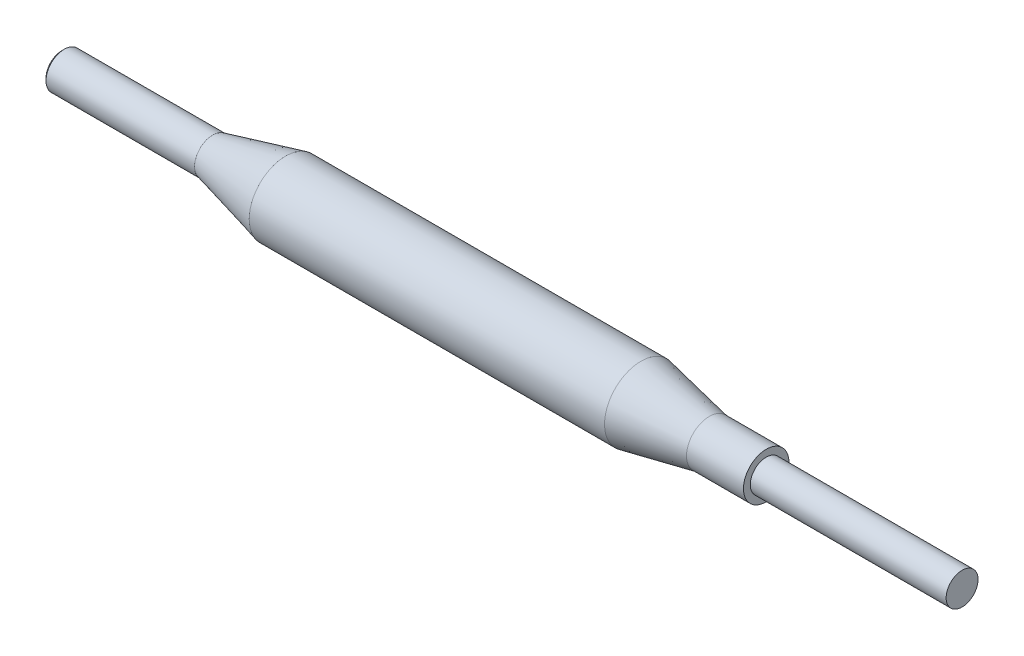
ISO-10303-21;
HEADER;
FILE_DESCRIPTION(('STEP AP214'),'2;1');
FILE_NAME('part.step','',(''),(''),'','','');
FILE_SCHEMA(('AUTOMOTIVE_DESIGN { 1 0 10303 214 1 1 1 1 }'));
ENDSEC;
DATA;
#1=APPLICATION_CONTEXT('core data for automotive mechanical design processes');
#2=APPLICATION_PROTOCOL_DEFINITION('international standard','automotive_design',2000,#1);
#3=PRODUCT_CONTEXT('',#1,'mechanical');
#4=PRODUCT('Part','Part','',(#3));
#5=PRODUCT_RELATED_PRODUCT_CATEGORY('part','',(#4));
#6=PRODUCT_DEFINITION_FORMATION('','',#4);
#7=PRODUCT_DEFINITION_CONTEXT('part definition',#1,'design');
#8=PRODUCT_DEFINITION('design','',#6,#7);
#9=PRODUCT_DEFINITION_SHAPE('','',#8);
#10=(LENGTH_UNIT() NAMED_UNIT(*) SI_UNIT(.MILLI.,.METRE.));
#11=(NAMED_UNIT(*) PLANE_ANGLE_UNIT() SI_UNIT($,.RADIAN.));
#12=(NAMED_UNIT(*) SI_UNIT($,.STERADIAN.) SOLID_ANGLE_UNIT());
#13=UNCERTAINTY_MEASURE_WITH_UNIT(LENGTH_MEASURE(1.E-05),#10,'distance_accuracy_value','');
#14=(GEOMETRIC_REPRESENTATION_CONTEXT(3) GLOBAL_UNCERTAINTY_ASSIGNED_CONTEXT((#13)) GLOBAL_UNIT_ASSIGNED_CONTEXT((#10,
#11,#12)) REPRESENTATION_CONTEXT('',''));
#15=CARTESIAN_POINT('',(0.,0.,0.));
#16=DIRECTION('',(0.,0.,1.));
#17=DIRECTION('',(1.,0.,0.));
#18=AXIS2_PLACEMENT_3D('',#15,#16,#17);
#19=CARTESIAN_POINT('',(1.89,0.,0.));
#20=DIRECTION('',(-1.,0.,0.));
#21=DIRECTION('',(0.,0.,1.));
#22=AXIS2_PLACEMENT_3D('',#19,#20,#21);
#23=CYLINDRICAL_SURFACE('',#22,5.);
#24=CARTESIAN_POINT('',(144.,0.,0.));
#25=DIRECTION('',(-1.,0.,0.));
#26=DIRECTION('',(0.,0.,1.));
#27=AXIS2_PLACEMENT_3D('',#24,#25,#26);
#28=CIRCLE('',#27,5.);
#29=CARTESIAN_POINT('',(144.,0.,5.));
#30=VERTEX_POINT('',#29);
#31=EDGE_CURVE('E80',#30,#30,#28,.T.);
#32=ORIENTED_EDGE('',*,*,#31,.F.);
#33=EDGE_LOOP('',(#32));
#34=FACE_BOUND('',#33,.T.);
#35=CARTESIAN_POINT('',(156.49,0.,0.));
#36=DIRECTION('',(-1.,0.,0.));
#37=DIRECTION('',(0.,0.,1.));
#38=AXIS2_PLACEMENT_3D('',#35,#36,#37);
#39=CIRCLE('',#38,5.);
#40=CARTESIAN_POINT('',(156.49,0.,5.));
#41=VERTEX_POINT('',#40);
#42=EDGE_CURVE('E53',#41,#41,#39,.T.);
#43=ORIENTED_EDGE('',*,*,#42,.T.);
#44=EDGE_LOOP('',(#43));
#45=FACE_BOUND('',#44,.T.);
#46=ADVANCED_FACE('F39',(#34,#45),#23,.T.);
#47=CARTESIAN_POINT('',(156.49,5.,0.));
#48=DIRECTION('',(-1.,0.,0.));
#49=DIRECTION('',(0.,0.,1.));
#50=AXIS2_PLACEMENT_3D('',#47,#48,#49);
#51=PLANE('',#50);
#52=ORIENTED_EDGE('',*,*,#42,.F.);
#53=EDGE_LOOP('',(#52));
#54=FACE_BOUND('',#53,.T.);
#55=CARTESIAN_POINT('',(156.49,0.,0.));
#56=DIRECTION('',(-1.,0.,0.));
#57=DIRECTION('',(0.,0.,1.));
#58=AXIS2_PLACEMENT_3D('',#55,#56,#57);
#59=CIRCLE('',#58,3.5);
#60=CARTESIAN_POINT('',(156.49,0.,3.5));
#61=VERTEX_POINT('',#60);
#62=EDGE_CURVE('E58',#61,#61,#59,.T.);
#63=ORIENTED_EDGE('',*,*,#62,.T.);
#64=EDGE_LOOP('',(#63));
#65=FACE_BOUND('',#64,.T.);
#66=ADVANCED_FACE('F89',(#54,#65),#51,.F.);
#67=CARTESIAN_POINT('',(1.89,0.,0.));
#68=DIRECTION('',(-1.,0.,0.));
#69=DIRECTION('',(0.,0.,1.));
#70=AXIS2_PLACEMENT_3D('',#67,#68,#69);
#71=CYLINDRICAL_SURFACE('',#70,3.5);
#72=ORIENTED_EDGE('',*,*,#62,.F.);
#73=EDGE_LOOP('',(#72));
#74=FACE_BOUND('',#73,.T.);
#75=CARTESIAN_POINT('',(199.49,0.,0.));
#76=DIRECTION('',(-1.,0.,0.));
#77=DIRECTION('',(0.,0.,1.));
#78=AXIS2_PLACEMENT_3D('',#75,#76,#77);
#79=CIRCLE('',#78,3.5);
#80=CARTESIAN_POINT('',(199.49,0.,3.5));
#81=VERTEX_POINT('',#80);
#82=EDGE_CURVE('E64',#81,#81,#79,.T.);
#83=ORIENTED_EDGE('',*,*,#82,.T.);
#84=EDGE_LOOP('',(#83));
#85=FACE_BOUND('',#84,.T.);
#86=ADVANCED_FACE('F94',(#74,#85),#71,.T.);
#87=CARTESIAN_POINT('',(199.49,3.5,0.));
#88=DIRECTION('',(-1.,0.,0.));
#89=DIRECTION('',(0.,0.,1.));
#90=AXIS2_PLACEMENT_3D('',#87,#88,#89);
#91=PLANE('',#90);
#92=ORIENTED_EDGE('',*,*,#82,.F.);
#93=EDGE_LOOP('',(#92));
#94=FACE_BOUND('',#93,.T.);
#95=ADVANCED_FACE('F100',(#94),#91,.F.);
#96=CARTESIAN_POINT('',(1.89,4.,0.));
#97=DIRECTION('',(1.,0.,0.));
#98=DIRECTION('',(0.,0.,-1.));
#99=AXIS2_PLACEMENT_3D('',#96,#97,#98);
#100=PLANE('',#99);
#101=CARTESIAN_POINT('',(1.89,0.,0.));
#102=DIRECTION('',(1.,0.,0.));
#103=DIRECTION('',(0.,0.,-1.));
#104=AXIS2_PLACEMENT_3D('',#101,#102,#103);
#105=CIRCLE('',#104,3.5);
#106=CARTESIAN_POINT('',(1.89,0.,-3.5));
#107=VERTEX_POINT('',#106);
#108=EDGE_CURVE('E48',#107,#107,#105,.F.);
#109=ORIENTED_EDGE('',*,*,#108,.T.);
#110=EDGE_LOOP('',(#109));
#111=FACE_BOUND('',#110,.T.);
#112=ADVANCED_FACE('F105',(#111),#100,.F.);
#113=CARTESIAN_POINT('',(1.89,0.,0.));
#114=DIRECTION('',(-1.,0.,0.));
#115=DIRECTION('',(0.,0.,1.));
#116=AXIS2_PLACEMENT_3D('',#113,#114,#115);
#117=CYLINDRICAL_SURFACE('',#116,4.);
#118=CARTESIAN_POINT('',(2.38999999999998,0.,0.));
#119=DIRECTION('',(1.,0.,0.));
#120=DIRECTION('',(0.,0.,-1.));
#121=AXIS2_PLACEMENT_3D('',#118,#119,#120);
#122=CIRCLE('',#121,4.);
#123=CARTESIAN_POINT('',(2.38999999999998,0.,-4.));
#124=VERTEX_POINT('',#123);
#125=EDGE_CURVE('E10',#124,#124,#122,.T.);
#126=ORIENTED_EDGE('',*,*,#125,.T.);
#127=EDGE_LOOP('',(#126));
#128=FACE_BOUND('',#127,.T.);
#129=CARTESIAN_POINT('',(35.,0.,0.));
#130=DIRECTION('',(-1.,0.,0.));
#131=DIRECTION('',(0.,0.,1.));
#132=AXIS2_PLACEMENT_3D('',#129,#130,#131);
#133=CIRCLE('',#132,4.);
#134=CARTESIAN_POINT('',(35.,0.,4.));
#135=VERTEX_POINT('',#134);
#136=EDGE_CURVE('E68',#135,#135,#133,.T.);
#137=ORIENTED_EDGE('',*,*,#136,.T.);
#138=EDGE_LOOP('',(#137));
#139=FACE_BOUND('',#138,.T.);
#140=ADVANCED_FACE('F110',(#128,#139),#117,.T.);
#141=CARTESIAN_POINT('',(51.,0.,0.));
#142=DIRECTION('',(1.,0.,0.));
#143=DIRECTION('',(0.,0.,-1.));
#144=AXIS2_PLACEMENT_3D('',#141,#142,#143);
#145=CONICAL_SURFACE('',#144,8.,0.244978663126864);
#146=ORIENTED_EDGE('',*,*,#136,.F.);
#147=EDGE_LOOP('',(#146));
#148=FACE_BOUND('',#147,.T.);
#149=CARTESIAN_POINT('',(51.,0.,0.));
#150=DIRECTION('',(-1.,0.,0.));
#151=DIRECTION('',(0.,0.,1.));
#152=AXIS2_PLACEMENT_3D('',#149,#150,#151);
#153=CIRCLE('',#152,8.);
#154=CARTESIAN_POINT('',(51.,0.,8.));
#155=VERTEX_POINT('',#154);
#156=EDGE_CURVE('E72',#155,#155,#153,.T.);
#157=ORIENTED_EDGE('',*,*,#156,.T.);
#158=EDGE_LOOP('',(#157));
#159=FACE_BOUND('',#158,.T.);
#160=ADVANCED_FACE('F115',(#148,#159),#145,.T.);
#161=CARTESIAN_POINT('',(1.89,0.,0.));
#162=DIRECTION('',(-1.,0.,0.));
#163=DIRECTION('',(0.,0.,1.));
#164=AXIS2_PLACEMENT_3D('',#161,#162,#163);
#165=CYLINDRICAL_SURFACE('',#164,8.);
#166=ORIENTED_EDGE('',*,*,#156,.F.);
#167=EDGE_LOOP('',(#166));
#168=FACE_BOUND('',#167,.T.);
#169=CARTESIAN_POINT('',(129.,0.,0.));
#170=DIRECTION('',(-1.,0.,0.));
#171=DIRECTION('',(0.,0.,1.));
#172=AXIS2_PLACEMENT_3D('',#169,#170,#171);
#173=CIRCLE('',#172,8.);
#174=CARTESIAN_POINT('',(129.,0.,8.));
#175=VERTEX_POINT('',#174);
#176=EDGE_CURVE('E76',#175,#175,#173,.T.);
#177=ORIENTED_EDGE('',*,*,#176,.T.);
#178=EDGE_LOOP('',(#177));
#179=FACE_BOUND('',#178,.T.);
#180=ADVANCED_FACE('F118',(#168,#179),#165,.T.);
#181=CARTESIAN_POINT('',(144.,0.,0.));
#182=DIRECTION('',(-1.,0.,0.));
#183=DIRECTION('',(0.,0.,1.));
#184=AXIS2_PLACEMENT_3D('',#181,#182,#183);
#185=CONICAL_SURFACE('',#184,5.,0.197395559849881);
#186=ORIENTED_EDGE('',*,*,#176,.F.);
#187=EDGE_LOOP('',(#186));
#188=FACE_BOUND('',#187,.T.);
#189=ORIENTED_EDGE('',*,*,#31,.T.);
#190=EDGE_LOOP('',(#189));
#191=FACE_BOUND('',#190,.T.);
#192=ADVANCED_FACE('F85',(#188,#191),#185,.T.);
#193=CARTESIAN_POINT('',(1.89,0.,0.));
#194=DIRECTION('',(1.,0.,0.));
#195=DIRECTION('',(0.,0.,-1.));
#196=AXIS2_PLACEMENT_3D('',#193,#194,#195);
#197=CONICAL_SURFACE('',#196,3.5,0.785398163397462);
#198=ORIENTED_EDGE('',*,*,#125,.F.);
#199=EDGE_LOOP('',(#198));
#200=FACE_BOUND('',#199,.T.);
#201=ORIENTED_EDGE('',*,*,#108,.F.);
#202=EDGE_LOOP('',(#201));
#203=FACE_BOUND('',#202,.T.);
#204=ADVANCED_FACE('F42',(#200,#203),#197,.T.);
#205=CLOSED_SHELL('',(#46,#66,#86,#95,#112,#140,#160,#180,#192,#204));
#206=MANIFOLD_SOLID_BREP('B2',#205);
#207=ADVANCED_BREP_SHAPE_REPRESENTATION('',(#18,#206),#14);
#208=SHAPE_DEFINITION_REPRESENTATION(#9,#207);
ENDSEC;
END-ISO-10303-21;
